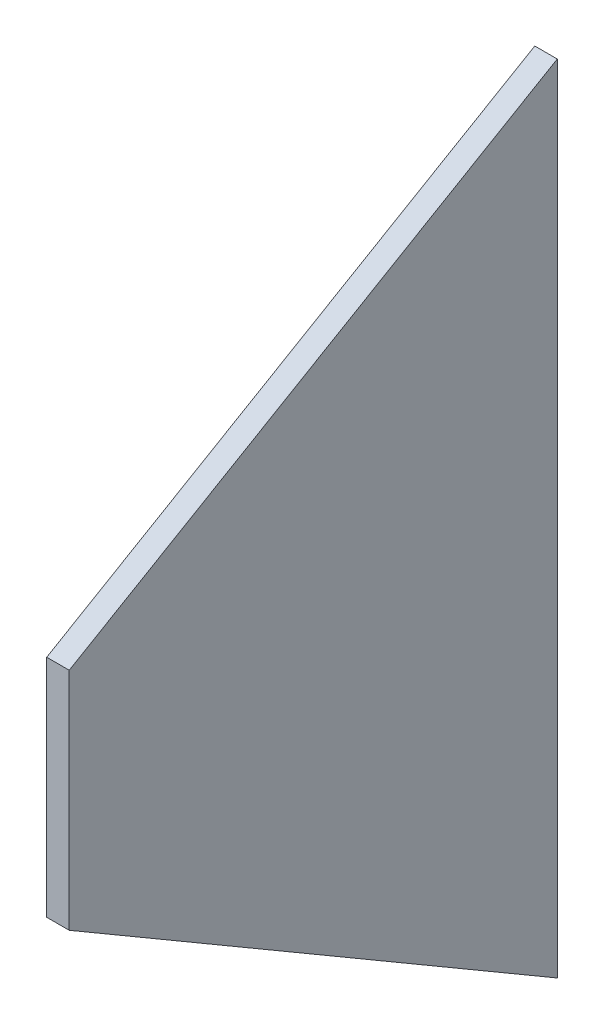
ISO-10303-21;
HEADER;
FILE_DESCRIPTION(('STEP AP214'),'2;1');
FILE_NAME('part.step','',(''),(''),'','','');
FILE_SCHEMA(('AUTOMOTIVE_DESIGN { 1 0 10303 214 1 1 1 1 }'));
ENDSEC;
DATA;
#1=APPLICATION_CONTEXT('core data for automotive mechanical design processes');
#2=APPLICATION_PROTOCOL_DEFINITION('international standard','automotive_design',2000,#1);
#3=PRODUCT_CONTEXT('',#1,'mechanical');
#4=PRODUCT('Part','Part','',(#3));
#5=PRODUCT_RELATED_PRODUCT_CATEGORY('part','',(#4));
#6=PRODUCT_DEFINITION_FORMATION('','',#4);
#7=PRODUCT_DEFINITION_CONTEXT('part definition',#1,'design');
#8=PRODUCT_DEFINITION('design','',#6,#7);
#9=PRODUCT_DEFINITION_SHAPE('','',#8);
#10=(LENGTH_UNIT() NAMED_UNIT(*) SI_UNIT(.MILLI.,.METRE.));
#11=(NAMED_UNIT(*) PLANE_ANGLE_UNIT() SI_UNIT($,.RADIAN.));
#12=(NAMED_UNIT(*) SI_UNIT($,.STERADIAN.) SOLID_ANGLE_UNIT());
#13=UNCERTAINTY_MEASURE_WITH_UNIT(LENGTH_MEASURE(1.E-05),#10,'distance_accuracy_value','');
#14=(GEOMETRIC_REPRESENTATION_CONTEXT(3) GLOBAL_UNCERTAINTY_ASSIGNED_CONTEXT((#13)) GLOBAL_UNIT_ASSIGNED_CONTEXT((#10,
#11,#12)) REPRESENTATION_CONTEXT('',''));
#15=CARTESIAN_POINT('',(0.,0.,0.));
#16=DIRECTION('',(0.,0.,1.));
#17=DIRECTION('',(1.,0.,0.));
#18=AXIS2_PLACEMENT_3D('',#15,#16,#17);
#19=CARTESIAN_POINT('',(3.,38.,65.));
#20=DIRECTION('',(0.,0.863296794119082,-0.504696587331156));
#21=DIRECTION('',(0.,0.504696587331156,0.863296794119082));
#22=AXIS2_PLACEMENT_3D('',#19,#20,#21);
#23=PLANE('',#22);
#24=DIRECTION('',(0.,-0.504696587331156,-0.863296794119082));
#25=VECTOR('',#24,1.);
#26=CARTESIAN_POINT('',(0.,38.,65.));
#27=LINE('',#26,#25);
#28=CARTESIAN_POINT('',(0.,38.,65.));
#29=VERTEX_POINT('',#28);
#30=CARTESIAN_POINT('',(0.,0.,0.));
#31=VERTEX_POINT('',#30);
#32=EDGE_CURVE('E113',#29,#31,#27,.T.);
#33=ORIENTED_EDGE('',*,*,#32,.T.);
#34=DIRECTION('',(-1.,0.,0.));
#35=VECTOR('',#34,1.);
#36=CARTESIAN_POINT('',(3.,0.,0.));
#37=LINE('',#36,#35);
#38=CARTESIAN_POINT('',(3.,0.,0.));
#39=VERTEX_POINT('',#38);
#40=EDGE_CURVE('E11',#39,#31,#37,.T.);
#41=ORIENTED_EDGE('',*,*,#40,.F.);
#42=DIRECTION('',(0.,-0.504696587331156,-0.863296794119082));
#43=VECTOR('',#42,1.);
#44=CARTESIAN_POINT('',(3.,38.,65.));
#45=LINE('',#44,#43);
#46=CARTESIAN_POINT('',(3.,38.,65.));
#47=VERTEX_POINT('',#46);
#48=EDGE_CURVE('E97',#47,#39,#45,.T.);
#49=ORIENTED_EDGE('',*,*,#48,.F.);
#50=DIRECTION('',(-1.,0.,0.));
#51=VECTOR('',#50,1.);
#52=CARTESIAN_POINT('',(3.,38.,65.));
#53=LINE('',#52,#51);
#54=EDGE_CURVE('E109',#47,#29,#53,.T.);
#55=ORIENTED_EDGE('',*,*,#54,.T.);
#56=EDGE_LOOP('',(#33,#41,#49,#55));
#57=FACE_BOUND('',#56,.T.);
#58=ADVANCED_FACE('F45',(#57),#23,.F.);
#59=CARTESIAN_POINT('',(3.,0.,0.));
#60=DIRECTION('',(0.,0.,1.));
#61=DIRECTION('',(1.,0.,0.));
#62=AXIS2_PLACEMENT_3D('',#59,#60,#61);
#63=PLANE('',#62);
#64=DIRECTION('',(0.,1.,0.));
#65=VECTOR('',#64,1.);
#66=CARTESIAN_POINT('',(0.,0.,0.));
#67=LINE('',#66,#65);
#68=CARTESIAN_POINT('',(0.,106.,0.));
#69=VERTEX_POINT('',#68);
#70=EDGE_CURVE('E102',#31,#69,#67,.T.);
#71=ORIENTED_EDGE('',*,*,#70,.T.);
#72=DIRECTION('',(-1.,0.,0.));
#73=VECTOR('',#72,1.);
#74=CARTESIAN_POINT('',(3.,106.,0.));
#75=LINE('',#74,#73);
#76=CARTESIAN_POINT('',(3.,106.,0.));
#77=VERTEX_POINT('',#76);
#78=EDGE_CURVE('E54',#77,#69,#75,.T.);
#79=ORIENTED_EDGE('',*,*,#78,.F.);
#80=DIRECTION('',(0.,1.,0.));
#81=VECTOR('',#80,1.);
#82=CARTESIAN_POINT('',(3.,0.,0.));
#83=LINE('',#82,#81);
#84=EDGE_CURVE('E92',#39,#77,#83,.T.);
#85=ORIENTED_EDGE('',*,*,#84,.F.);
#86=ORIENTED_EDGE('',*,*,#40,.T.);
#87=EDGE_LOOP('',(#71,#79,#85,#86));
#88=FACE_BOUND('',#87,.T.);
#89=ADVANCED_FACE('F101',(#88),#63,.F.);
#90=CARTESIAN_POINT('',(3.,106.,0.));
#91=DIRECTION('',(0.,-0.863296794119082,-0.504696587331156));
#92=DIRECTION('',(0.,0.504696587331156,-0.863296794119082));
#93=AXIS2_PLACEMENT_3D('',#90,#91,#92);
#94=PLANE('',#93);
#95=DIRECTION('',(0.,-0.504696587331156,0.863296794119082));
#96=VECTOR('',#95,1.);
#97=CARTESIAN_POINT('',(0.,106.,0.));
#98=LINE('',#97,#96);
#99=CARTESIAN_POINT('',(0.,68.,65.));
#100=VERTEX_POINT('',#99);
#101=EDGE_CURVE('E79',#69,#100,#98,.T.);
#102=ORIENTED_EDGE('',*,*,#101,.T.);
#103=DIRECTION('',(-1.,0.,0.));
#104=VECTOR('',#103,1.);
#105=CARTESIAN_POINT('',(3.,68.,65.));
#106=LINE('',#105,#104);
#107=CARTESIAN_POINT('',(3.,68.,65.));
#108=VERTEX_POINT('',#107);
#109=EDGE_CURVE('E104',#108,#100,#106,.T.);
#110=ORIENTED_EDGE('',*,*,#109,.F.);
#111=DIRECTION('',(0.,-0.504696587331156,0.863296794119082));
#112=VECTOR('',#111,1.);
#113=CARTESIAN_POINT('',(3.,106.,0.));
#114=LINE('',#113,#112);
#115=EDGE_CURVE('E95',#77,#108,#114,.T.);
#116=ORIENTED_EDGE('',*,*,#115,.F.);
#117=ORIENTED_EDGE('',*,*,#78,.T.);
#118=EDGE_LOOP('',(#102,#110,#116,#117));
#119=FACE_BOUND('',#118,.T.);
#120=ADVANCED_FACE('F105',(#119),#94,.F.);
#121=CARTESIAN_POINT('',(3.,68.,65.));
#122=DIRECTION('',(0.,0.,-1.));
#123=DIRECTION('',(-1.,0.,0.));
#124=AXIS2_PLACEMENT_3D('',#121,#122,#123);
#125=PLANE('',#124);
#126=DIRECTION('',(0.,-1.,0.));
#127=VECTOR('',#126,1.);
#128=CARTESIAN_POINT('',(0.,68.,65.));
#129=LINE('',#128,#127);
#130=EDGE_CURVE('E85',#100,#29,#129,.T.);
#131=ORIENTED_EDGE('',*,*,#130,.T.);
#132=ORIENTED_EDGE('',*,*,#54,.F.);
#133=DIRECTION('',(0.,-1.,0.));
#134=VECTOR('',#133,1.);
#135=CARTESIAN_POINT('',(3.,68.,65.));
#136=LINE('',#135,#134);
#137=EDGE_CURVE('E62',#108,#47,#136,.T.);
#138=ORIENTED_EDGE('',*,*,#137,.F.);
#139=ORIENTED_EDGE('',*,*,#109,.T.);
#140=EDGE_LOOP('',(#131,#132,#138,#139));
#141=FACE_BOUND('',#140,.T.);
#142=ADVANCED_FACE('F126',(#141),#125,.F.);
#143=CARTESIAN_POINT('',(3.,0.,0.));
#144=DIRECTION('',(-1.,0.,0.));
#145=DIRECTION('',(0.,0.,1.));
#146=AXIS2_PLACEMENT_3D('',#143,#144,#145);
#147=PLANE('',#146);
#148=ORIENTED_EDGE('',*,*,#48,.T.);
#149=ORIENTED_EDGE('',*,*,#84,.T.);
#150=ORIENTED_EDGE('',*,*,#115,.T.);
#151=ORIENTED_EDGE('',*,*,#137,.T.);
#152=EDGE_LOOP('',(#148,#149,#150,#151));
#153=FACE_BOUND('',#152,.T.);
#154=ADVANCED_FACE('F93',(#153),#147,.F.);
#155=CARTESIAN_POINT('',(0.,0.,0.));
#156=DIRECTION('',(-1.,0.,0.));
#157=DIRECTION('',(0.,0.,1.));
#158=AXIS2_PLACEMENT_3D('',#155,#156,#157);
#159=PLANE('',#158);
#160=ORIENTED_EDGE('',*,*,#32,.F.);
#161=ORIENTED_EDGE('',*,*,#130,.F.);
#162=ORIENTED_EDGE('',*,*,#101,.F.);
#163=ORIENTED_EDGE('',*,*,#70,.F.);
#164=EDGE_LOOP('',(#160,#161,#162,#163));
#165=FACE_BOUND('',#164,.T.);
#166=ADVANCED_FACE('F129',(#165),#159,.T.);
#167=CLOSED_SHELL('',(#58,#89,#120,#142,#154,#166));
#168=MANIFOLD_SOLID_BREP('B2',#167);
#169=ADVANCED_BREP_SHAPE_REPRESENTATION('',(#18,#168),#14);
#170=SHAPE_DEFINITION_REPRESENTATION(#9,#169);
ENDSEC;
END-ISO-10303-21;
